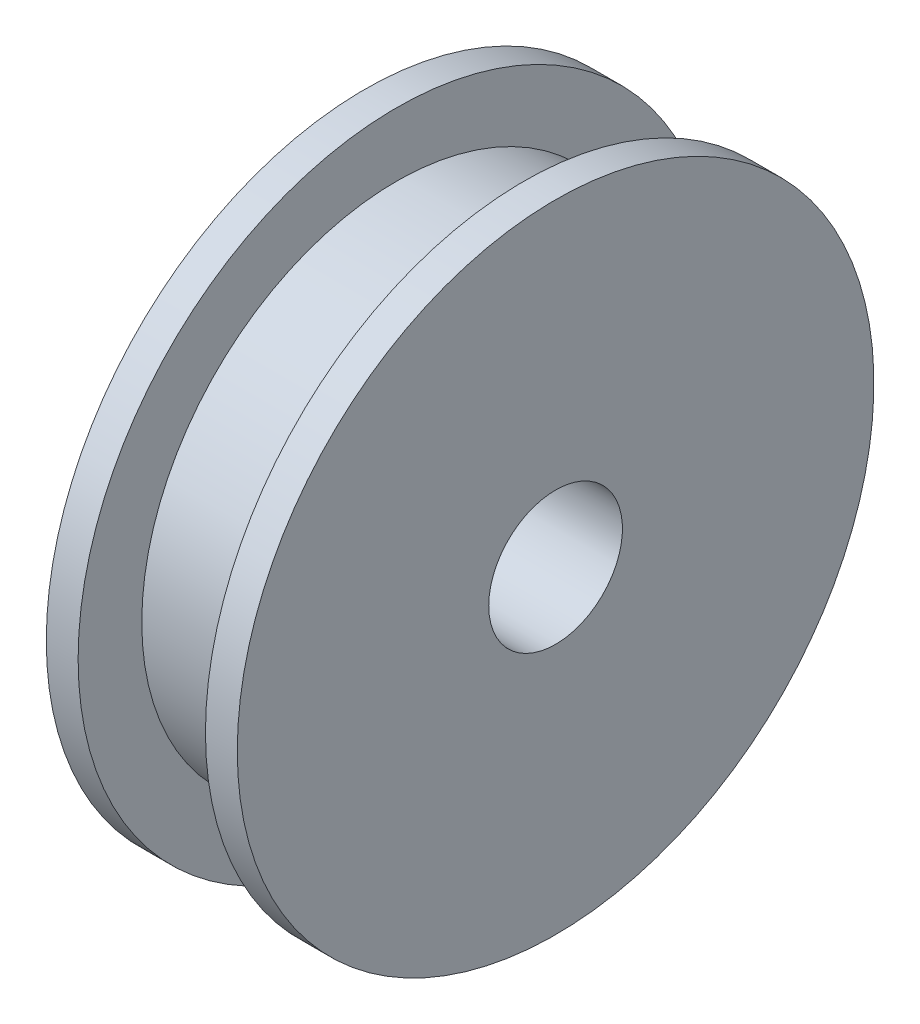
ISO-10303-21;
HEADER;
FILE_DESCRIPTION(('STEP AP214'),'2;1');
FILE_NAME('part.step','',(''),(''),'','','');
FILE_SCHEMA(('AUTOMOTIVE_DESIGN { 1 0 10303 214 1 1 1 1 }'));
ENDSEC;
DATA;
#1=APPLICATION_CONTEXT('core data for automotive mechanical design processes');
#2=APPLICATION_PROTOCOL_DEFINITION('international standard','automotive_design',2000,#1);
#3=PRODUCT_CONTEXT('',#1,'mechanical');
#4=PRODUCT('Part','Part','',(#3));
#5=PRODUCT_RELATED_PRODUCT_CATEGORY('part','',(#4));
#6=PRODUCT_DEFINITION_FORMATION('','',#4);
#7=PRODUCT_DEFINITION_CONTEXT('part definition',#1,'design');
#8=PRODUCT_DEFINITION('design','',#6,#7);
#9=PRODUCT_DEFINITION_SHAPE('','',#8);
#10=(LENGTH_UNIT() NAMED_UNIT(*) SI_UNIT(.MILLI.,.METRE.));
#11=(NAMED_UNIT(*) PLANE_ANGLE_UNIT() SI_UNIT($,.RADIAN.));
#12=(NAMED_UNIT(*) SI_UNIT($,.STERADIAN.) SOLID_ANGLE_UNIT());
#13=UNCERTAINTY_MEASURE_WITH_UNIT(LENGTH_MEASURE(1.E-05),#10,'distance_accuracy_value','');
#14=(GEOMETRIC_REPRESENTATION_CONTEXT(3) GLOBAL_UNCERTAINTY_ASSIGNED_CONTEXT((#13)) GLOBAL_UNIT_ASSIGNED_CONTEXT((#10,
#11,#12)) REPRESENTATION_CONTEXT('',''));
#15=CARTESIAN_POINT('',(0.,0.,0.));
#16=DIRECTION('',(0.,0.,1.));
#17=DIRECTION('',(1.,0.,0.));
#18=AXIS2_PLACEMENT_3D('',#15,#16,#17);
#19=CARTESIAN_POINT('',(1.5,0.,0.));
#20=DIRECTION('',(1.,0.,0.));
#21=DIRECTION('',(0.,0.,-1.));
#22=AXIS2_PLACEMENT_3D('',#19,#20,#21);
#23=PLANE('',#22);
#24=CARTESIAN_POINT('',(1.5,0.,0.));
#25=DIRECTION('',(-1.,0.,0.));
#26=DIRECTION('',(0.,0.,1.));
#27=AXIS2_PLACEMENT_3D('',#24,#25,#26);
#28=CIRCLE('',#27,1.05);
#29=CARTESIAN_POINT('',(1.5,0.,1.05));
#30=VERTEX_POINT('',#29);
#31=EDGE_CURVE('E75',#30,#30,#28,.T.);
#32=ORIENTED_EDGE('',*,*,#31,.T.);
#33=EDGE_LOOP('',(#32));
#34=FACE_BOUND('',#33,.T.);
#35=CARTESIAN_POINT('',(1.5,0.,0.));
#36=DIRECTION('',(-1.,0.,0.));
#37=DIRECTION('',(0.,0.,1.));
#38=AXIS2_PLACEMENT_3D('',#35,#36,#37);
#39=CIRCLE('',#38,5.);
#40=CARTESIAN_POINT('',(1.5,0.,5.));
#41=VERTEX_POINT('',#40);
#42=EDGE_CURVE('E10',#41,#41,#39,.T.);
#43=ORIENTED_EDGE('',*,*,#42,.F.);
#44=EDGE_LOOP('',(#43));
#45=FACE_BOUND('',#44,.T.);
#46=ADVANCED_FACE('F38',(#34,#45),#23,.T.);
#47=CARTESIAN_POINT('',(0.,0.,0.));
#48=DIRECTION('',(-1.,0.,0.));
#49=DIRECTION('',(0.,0.,1.));
#50=AXIS2_PLACEMENT_3D('',#47,#48,#49);
#51=CYLINDRICAL_SURFACE('',#50,5.);
#52=ORIENTED_EDGE('',*,*,#42,.T.);
#53=EDGE_LOOP('',(#52));
#54=FACE_BOUND('',#53,.T.);
#55=CARTESIAN_POINT('',(1.,0.,0.));
#56=DIRECTION('',(-1.,0.,0.));
#57=DIRECTION('',(0.,0.,1.));
#58=AXIS2_PLACEMENT_3D('',#55,#56,#57);
#59=CIRCLE('',#58,5.);
#60=CARTESIAN_POINT('',(1.,0.,5.));
#61=VERTEX_POINT('',#60);
#62=EDGE_CURVE('E45',#61,#61,#59,.T.);
#63=ORIENTED_EDGE('',*,*,#62,.F.);
#64=EDGE_LOOP('',(#63));
#65=FACE_BOUND('',#64,.T.);
#66=ADVANCED_FACE('F107',(#54,#65),#51,.T.);
#67=CARTESIAN_POINT('',(1.,0.,0.));
#68=DIRECTION('',(-1.,0.,0.));
#69=DIRECTION('',(0.,0.,1.));
#70=AXIS2_PLACEMENT_3D('',#67,#68,#69);
#71=PLANE('',#70);
#72=ORIENTED_EDGE('',*,*,#62,.T.);
#73=EDGE_LOOP('',(#72));
#74=FACE_BOUND('',#73,.T.);
#75=CARTESIAN_POINT('',(1.,0.,0.));
#76=DIRECTION('',(-1.,0.,0.));
#77=DIRECTION('',(0.,0.,1.));
#78=AXIS2_PLACEMENT_3D('',#75,#76,#77);
#79=CIRCLE('',#78,4.);
#80=CARTESIAN_POINT('',(1.,0.,4.));
#81=VERTEX_POINT('',#80);
#82=EDGE_CURVE('E51',#81,#81,#79,.T.);
#83=ORIENTED_EDGE('',*,*,#82,.F.);
#84=EDGE_LOOP('',(#83));
#85=FACE_BOUND('',#84,.T.);
#86=ADVANCED_FACE('F111',(#74,#85),#71,.T.);
#87=CARTESIAN_POINT('',(0.,0.,0.));
#88=DIRECTION('',(-1.,0.,0.));
#89=DIRECTION('',(0.,0.,1.));
#90=AXIS2_PLACEMENT_3D('',#87,#88,#89);
#91=CYLINDRICAL_SURFACE('',#90,4.);
#92=ORIENTED_EDGE('',*,*,#82,.T.);
#93=EDGE_LOOP('',(#92));
#94=FACE_BOUND('',#93,.T.);
#95=CARTESIAN_POINT('',(-1.,0.,0.));
#96=DIRECTION('',(-1.,0.,0.));
#97=DIRECTION('',(0.,0.,1.));
#98=AXIS2_PLACEMENT_3D('',#95,#96,#97);
#99=CIRCLE('',#98,4.);
#100=CARTESIAN_POINT('',(-1.,0.,4.));
#101=VERTEX_POINT('',#100);
#102=EDGE_CURVE('E57',#101,#101,#99,.T.);
#103=ORIENTED_EDGE('',*,*,#102,.F.);
#104=EDGE_LOOP('',(#103));
#105=FACE_BOUND('',#104,.T.);
#106=ADVANCED_FACE('F103',(#94,#105),#91,.T.);
#107=CARTESIAN_POINT('',(-1.,0.,0.));
#108=DIRECTION('',(1.,0.,0.));
#109=DIRECTION('',(0.,0.,-1.));
#110=AXIS2_PLACEMENT_3D('',#107,#108,#109);
#111=PLANE('',#110);
#112=ORIENTED_EDGE('',*,*,#102,.T.);
#113=EDGE_LOOP('',(#112));
#114=FACE_BOUND('',#113,.T.);
#115=CARTESIAN_POINT('',(-1.,0.,0.));
#116=DIRECTION('',(-1.,0.,0.));
#117=DIRECTION('',(0.,0.,1.));
#118=AXIS2_PLACEMENT_3D('',#115,#116,#117);
#119=CIRCLE('',#118,5.);
#120=CARTESIAN_POINT('',(-1.,0.,5.));
#121=VERTEX_POINT('',#120);
#122=EDGE_CURVE('E63',#121,#121,#119,.T.);
#123=ORIENTED_EDGE('',*,*,#122,.F.);
#124=EDGE_LOOP('',(#123));
#125=FACE_BOUND('',#124,.T.);
#126=ADVANCED_FACE('F97',(#114,#125),#111,.T.);
#127=CARTESIAN_POINT('',(0.,0.,0.));
#128=DIRECTION('',(-1.,0.,0.));
#129=DIRECTION('',(0.,0.,1.));
#130=AXIS2_PLACEMENT_3D('',#127,#128,#129);
#131=CYLINDRICAL_SURFACE('',#130,5.);
#132=ORIENTED_EDGE('',*,*,#122,.T.);
#133=EDGE_LOOP('',(#132));
#134=FACE_BOUND('',#133,.T.);
#135=CARTESIAN_POINT('',(-1.5,0.,0.));
#136=DIRECTION('',(-1.,0.,0.));
#137=DIRECTION('',(0.,0.,1.));
#138=AXIS2_PLACEMENT_3D('',#135,#136,#137);
#139=CIRCLE('',#138,5.);
#140=CARTESIAN_POINT('',(-1.5,0.,5.));
#141=VERTEX_POINT('',#140);
#142=EDGE_CURVE('E67',#141,#141,#139,.T.);
#143=ORIENTED_EDGE('',*,*,#142,.F.);
#144=EDGE_LOOP('',(#143));
#145=FACE_BOUND('',#144,.T.);
#146=ADVANCED_FACE('F92',(#134,#145),#131,.T.);
#147=CARTESIAN_POINT('',(-1.5,0.,0.));
#148=DIRECTION('',(1.,0.,0.));
#149=DIRECTION('',(0.,0.,-1.));
#150=AXIS2_PLACEMENT_3D('',#147,#148,#149);
#151=PLANE('',#150);
#152=CARTESIAN_POINT('',(-1.5,0.,0.));
#153=DIRECTION('',(-1.,0.,0.));
#154=DIRECTION('',(0.,0.,1.));
#155=AXIS2_PLACEMENT_3D('',#152,#153,#154);
#156=CIRCLE('',#155,1.05);
#157=CARTESIAN_POINT('',(-1.5,0.,1.05));
#158=VERTEX_POINT('',#157);
#159=EDGE_CURVE('E71',#158,#158,#156,.T.);
#160=ORIENTED_EDGE('',*,*,#159,.F.);
#161=EDGE_LOOP('',(#160));
#162=FACE_BOUND('',#161,.T.);
#163=ORIENTED_EDGE('',*,*,#142,.T.);
#164=EDGE_LOOP('',(#163));
#165=FACE_BOUND('',#164,.T.);
#166=ADVANCED_FACE('F86',(#162,#165),#151,.F.);
#167=CARTESIAN_POINT('',(0.,0.,0.));
#168=DIRECTION('',(-1.,0.,0.));
#169=DIRECTION('',(0.,0.,1.));
#170=AXIS2_PLACEMENT_3D('',#167,#168,#169);
#171=CYLINDRICAL_SURFACE('',#170,1.05);
#172=ORIENTED_EDGE('',*,*,#31,.F.);
#173=EDGE_LOOP('',(#172));
#174=FACE_BOUND('',#173,.T.);
#175=ORIENTED_EDGE('',*,*,#159,.T.);
#176=EDGE_LOOP('',(#175));
#177=FACE_BOUND('',#176,.T.);
#178=ADVANCED_FACE('F83',(#174,#177),#171,.F.);
#179=CLOSED_SHELL('',(#46,#66,#86,#106,#126,#146,#166,#178));
#180=MANIFOLD_SOLID_BREP('B2',#179);
#181=ADVANCED_BREP_SHAPE_REPRESENTATION('',(#18,#180),#14);
#182=SHAPE_DEFINITION_REPRESENTATION(#9,#181);
ENDSEC;
END-ISO-10303-21;
